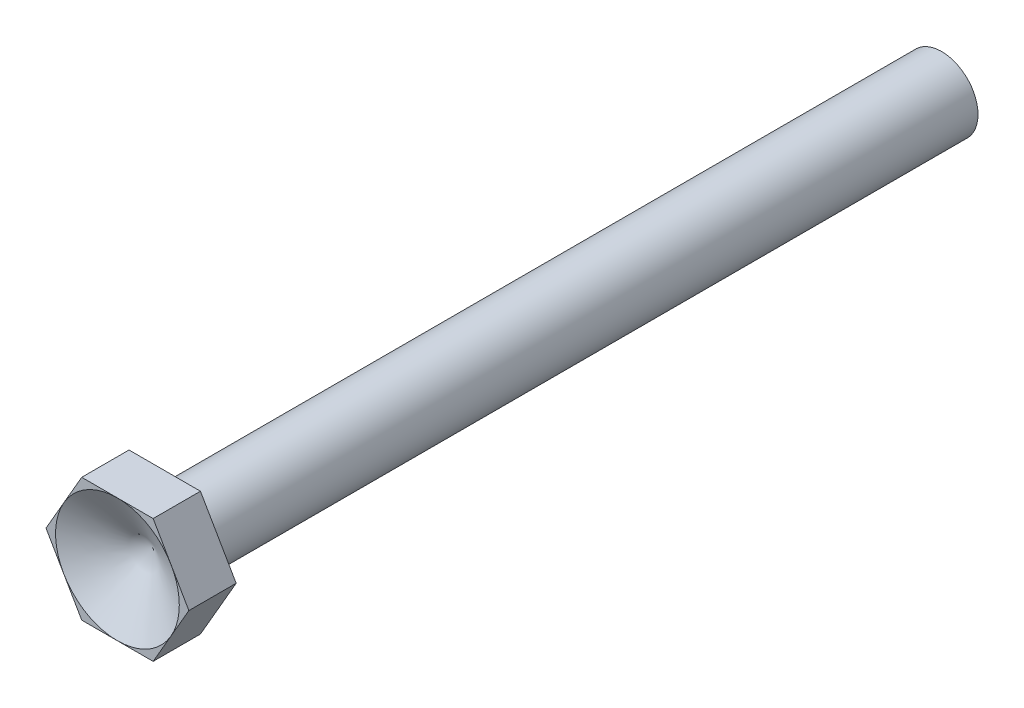
ISO-10303-21;
HEADER;
FILE_DESCRIPTION(('STEP AP214'),'2;1');
FILE_NAME('part.step','',(''),(''),'','','');
FILE_SCHEMA(('AUTOMOTIVE_DESIGN { 1 0 10303 214 1 1 1 1 }'));
ENDSEC;
DATA;
#1=APPLICATION_CONTEXT('core data for automotive mechanical design processes');
#2=APPLICATION_PROTOCOL_DEFINITION('international standard','automotive_design',2000,#1);
#3=PRODUCT_CONTEXT('',#1,'mechanical');
#4=PRODUCT('Part','Part','',(#3));
#5=PRODUCT_RELATED_PRODUCT_CATEGORY('part','',(#4));
#6=PRODUCT_DEFINITION_FORMATION('','',#4);
#7=PRODUCT_DEFINITION_CONTEXT('part definition',#1,'design');
#8=PRODUCT_DEFINITION('design','',#6,#7);
#9=PRODUCT_DEFINITION_SHAPE('','',#8);
#10=(LENGTH_UNIT() NAMED_UNIT(*) SI_UNIT(.MILLI.,.METRE.));
#11=(NAMED_UNIT(*) PLANE_ANGLE_UNIT() SI_UNIT($,.RADIAN.));
#12=(NAMED_UNIT(*) SI_UNIT($,.STERADIAN.) SOLID_ANGLE_UNIT());
#13=UNCERTAINTY_MEASURE_WITH_UNIT(LENGTH_MEASURE(1.E-05),#10,'distance_accuracy_value','');
#14=(GEOMETRIC_REPRESENTATION_CONTEXT(3) GLOBAL_UNCERTAINTY_ASSIGNED_CONTEXT((#13)) GLOBAL_UNIT_ASSIGNED_CONTEXT((#10,
#11,#12)) REPRESENTATION_CONTEXT('',''));
#15=CARTESIAN_POINT('',(0.,0.,0.));
#16=DIRECTION('',(0.,0.,1.));
#17=DIRECTION('',(1.,0.,0.));
#18=AXIS2_PLACEMENT_3D('',#15,#16,#17);
#19=CARTESIAN_POINT('',(0.,0.,116.5));
#20=DIRECTION('',(0.,0.,1.));
#21=DIRECTION('',(1.,0.,0.));
#22=AXIS2_PLACEMENT_3D('',#19,#20,#21);
#23=PLANE('',#22);
#24=CARTESIAN_POINT('',(0.,0.,116.5));
#25=DIRECTION('',(0.,0.,1.));
#26=DIRECTION('',(1.,0.,0.));
#27=AXIS2_PLACEMENT_3D('',#24,#25,#26);
#28=CIRCLE('',#27,17.);
#29=CARTESIAN_POINT('',(14.7224318643355,8.5,116.5));
#30=VERTEX_POINT('',#29);
#31=CARTESIAN_POINT('',(0.,17.,116.5));
#32=VERTEX_POINT('',#31);
#33=EDGE_CURVE('E173',#30,#32,#28,.T.);
#34=ORIENTED_EDGE('',*,*,#33,.F.);
#35=DIRECTION('',(-0.5,0.866025403784439,0.));
#36=VECTOR('',#35,1.);
#37=CARTESIAN_POINT('',(19.6299091524473,0.,116.5));
#38=LINE('',#37,#36);
#39=CARTESIAN_POINT('',(9.81495457622365,17.,116.5));
#40=VERTEX_POINT('',#39);
#41=EDGE_CURVE('E230',#30,#40,#38,.T.);
#42=ORIENTED_EDGE('',*,*,#41,.T.);
#43=DIRECTION('',(-1.,0.,0.));
#44=VECTOR('',#43,1.);
#45=CARTESIAN_POINT('',(9.81495457622365,17.,116.5));
#46=LINE('',#45,#44);
#47=EDGE_CURVE('E139',#40,#32,#46,.T.);
#48=ORIENTED_EDGE('',*,*,#47,.T.);
#49=EDGE_LOOP('',(#34,#42,#48));
#50=FACE_BOUND('',#49,.T.);
#51=ADVANCED_FACE('F51',(#50),#23,.T.);
#52=CARTESIAN_POINT('',(0.,0.,116.5));
#53=DIRECTION('',(0.,0.,1.));
#54=DIRECTION('',(1.,0.,0.));
#55=AXIS2_PLACEMENT_3D('',#52,#53,#54);
#56=CIRCLE('',#55,17.);
#57=CARTESIAN_POINT('',(-14.7224318643355,8.5,116.5));
#58=VERTEX_POINT('',#57);
#59=EDGE_CURVE('E11',#32,#58,#56,.T.);
#60=ORIENTED_EDGE('',*,*,#59,.F.);
#61=CARTESIAN_POINT('',(-9.81495457622364,17.,116.5));
#62=VERTEX_POINT('',#61);
#63=EDGE_CURVE('E238',#32,#62,#46,.T.);
#64=ORIENTED_EDGE('',*,*,#63,.T.);
#65=DIRECTION('',(-0.5,-0.866025403784439,0.));
#66=VECTOR('',#65,1.);
#67=CARTESIAN_POINT('',(-9.81495457622364,17.,116.5));
#68=LINE('',#67,#66);
#69=EDGE_CURVE('E138',#62,#58,#68,.T.);
#70=ORIENTED_EDGE('',*,*,#69,.T.);
#71=EDGE_LOOP('',(#60,#64,#70));
#72=FACE_BOUND('',#71,.T.);
#73=ADVANCED_FACE('F248',(#72),#23,.T.);
#74=CARTESIAN_POINT('',(-14.7224318643355,-8.5,116.5));
#75=VERTEX_POINT('',#74);
#76=EDGE_CURVE('E61',#58,#75,#56,.T.);
#77=ORIENTED_EDGE('',*,*,#76,.F.);
#78=CARTESIAN_POINT('',(-19.6299091524473,0.,116.5));
#79=VERTEX_POINT('',#78);
#80=EDGE_CURVE('E126',#58,#79,#68,.T.);
#81=ORIENTED_EDGE('',*,*,#80,.T.);
#82=DIRECTION('',(0.5,-0.866025403784439,0.));
#83=VECTOR('',#82,1.);
#84=CARTESIAN_POINT('',(-19.6299091524473,0.,116.5));
#85=LINE('',#84,#83);
#86=EDGE_CURVE('E131',#79,#75,#85,.T.);
#87=ORIENTED_EDGE('',*,*,#86,.T.);
#88=EDGE_LOOP('',(#77,#81,#87));
#89=FACE_BOUND('',#88,.T.);
#90=ADVANCED_FACE('F128',(#89),#23,.T.);
#91=CARTESIAN_POINT('',(0.,-17.,116.5));
#92=VERTEX_POINT('',#91);
#93=EDGE_CURVE('E213',#75,#92,#56,.T.);
#94=ORIENTED_EDGE('',*,*,#93,.F.);
#95=CARTESIAN_POINT('',(-9.81495457622364,-17.,116.5));
#96=VERTEX_POINT('',#95);
#97=EDGE_CURVE('E156',#75,#96,#85,.T.);
#98=ORIENTED_EDGE('',*,*,#97,.T.);
#99=DIRECTION('',(1.,0.,0.));
#100=VECTOR('',#99,1.);
#101=CARTESIAN_POINT('',(-9.81495457622364,-17.,116.5));
#102=LINE('',#101,#100);
#103=EDGE_CURVE('E161',#96,#92,#102,.T.);
#104=ORIENTED_EDGE('',*,*,#103,.T.);
#105=EDGE_LOOP('',(#94,#98,#104));
#106=FACE_BOUND('',#105,.T.);
#107=ADVANCED_FACE('F220',(#106),#23,.T.);
#108=CARTESIAN_POINT('',(14.7224318643355,-8.5,116.5));
#109=VERTEX_POINT('',#108);
#110=EDGE_CURVE('E68',#92,#109,#56,.T.);
#111=ORIENTED_EDGE('',*,*,#110,.F.);
#112=CARTESIAN_POINT('',(9.81495457622364,-17.,116.5));
#113=VERTEX_POINT('',#112);
#114=EDGE_CURVE('E76',#92,#113,#102,.T.);
#115=ORIENTED_EDGE('',*,*,#114,.T.);
#116=DIRECTION('',(0.5,0.866025403784438,0.));
#117=VECTOR('',#116,1.);
#118=CARTESIAN_POINT('',(9.81495457622364,-17.,116.5));
#119=LINE('',#118,#117);
#120=EDGE_CURVE('E226',#113,#109,#119,.T.);
#121=ORIENTED_EDGE('',*,*,#120,.T.);
#122=EDGE_LOOP('',(#111,#115,#121));
#123=FACE_BOUND('',#122,.T.);
#124=ADVANCED_FACE('F279',(#123),#23,.T.);
#125=CARTESIAN_POINT('',(0.,0.,110.));
#126=DIRECTION('',(0.,0.,-1.));
#127=DIRECTION('',(-1.,0.,0.));
#128=AXIS2_PLACEMENT_3D('',#125,#126,#127);
#129=CYLINDRICAL_SURFACE('',#128,10.);
#130=CARTESIAN_POINT('',(0.,0.,-110.));
#131=DIRECTION('',(0.,0.,1.));
#132=DIRECTION('',(1.,0.,0.));
#133=AXIS2_PLACEMENT_3D('',#130,#131,#132);
#134=CIRCLE('',#133,10.);
#135=CARTESIAN_POINT('',(10.,0.,-110.));
#136=VERTEX_POINT('',#135);
#137=EDGE_CURVE('E200',#136,#136,#134,.T.);
#138=ORIENTED_EDGE('',*,*,#137,.T.);
#139=EDGE_LOOP('',(#138));
#140=FACE_BOUND('',#139,.T.);
#141=CARTESIAN_POINT('',(0.,0.,103.5));
#142=DIRECTION('',(0.,0.,1.));
#143=DIRECTION('',(1.,0.,0.));
#144=AXIS2_PLACEMENT_3D('',#141,#142,#143);
#145=CIRCLE('',#144,10.);
#146=CARTESIAN_POINT('',(10.,0.,103.5));
#147=VERTEX_POINT('',#146);
#148=EDGE_CURVE('E203',#147,#147,#145,.T.);
#149=ORIENTED_EDGE('',*,*,#148,.F.);
#150=EDGE_LOOP('',(#149));
#151=FACE_BOUND('',#150,.T.);
#152=ADVANCED_FACE('F53',(#140,#151),#129,.T.);
#153=CARTESIAN_POINT('',(0.,0.,-110.));
#154=DIRECTION('',(0.,0.,1.));
#155=DIRECTION('',(1.,0.,0.));
#156=AXIS2_PLACEMENT_3D('',#153,#154,#155);
#157=PLANE('',#156);
#158=ORIENTED_EDGE('',*,*,#137,.F.);
#159=EDGE_LOOP('',(#158));
#160=FACE_BOUND('',#159,.T.);
#161=ADVANCED_FACE('F290',(#160),#157,.F.);
#162=CARTESIAN_POINT('',(9.81495457622364,-17.,116.5));
#163=DIRECTION('',(-0.866025403784438,0.5,0.));
#164=DIRECTION('',(-0.5,-0.866025403784439,0.));
#165=AXIS2_PLACEMENT_3D('',#162,#163,#164);
#166=PLANE('',#165);
#167=DIRECTION('',(0.5,0.866025403784438,0.));
#168=VECTOR('',#167,1.);
#169=CARTESIAN_POINT('',(9.81495457622364,-17.,103.5));
#170=LINE('',#169,#168);
#171=CARTESIAN_POINT('',(9.81495457622364,-17.,103.5));
#172=VERTEX_POINT('',#171);
#173=CARTESIAN_POINT('',(19.6299091524473,0.,103.5));
#174=VERTEX_POINT('',#173);
#175=EDGE_CURVE('E168',#172,#174,#170,.T.);
#176=ORIENTED_EDGE('',*,*,#175,.T.);
#177=DIRECTION('',(0.,0.,-1.));
#178=VECTOR('',#177,1.);
#179=CARTESIAN_POINT('',(19.6299091524473,0.,116.5));
#180=LINE('',#179,#178);
#181=CARTESIAN_POINT('',(19.6299091524473,0.,116.5));
#182=VERTEX_POINT('',#181);
#183=EDGE_CURVE('E196',#182,#174,#180,.T.);
#184=ORIENTED_EDGE('',*,*,#183,.F.);
#185=EDGE_CURVE('E112',#109,#182,#119,.T.);
#186=ORIENTED_EDGE('',*,*,#185,.F.);
#187=ORIENTED_EDGE('',*,*,#120,.F.);
#188=DIRECTION('',(0.,0.,-1.));
#189=VECTOR('',#188,1.);
#190=CARTESIAN_POINT('',(9.81495457622364,-17.,116.5));
#191=LINE('',#190,#189);
#192=EDGE_CURVE('E167',#113,#172,#191,.T.);
#193=ORIENTED_EDGE('',*,*,#192,.T.);
#194=EDGE_LOOP('',(#176,#184,#186,#187,#193));
#195=FACE_BOUND('',#194,.T.);
#196=ADVANCED_FACE('F227',(#195),#166,.F.);
#197=CARTESIAN_POINT('',(19.6299091524473,0.,116.5));
#198=DIRECTION('',(-0.866025403784439,-0.5,0.));
#199=DIRECTION('',(0.5,-0.866025403784439,0.));
#200=AXIS2_PLACEMENT_3D('',#197,#198,#199);
#201=PLANE('',#200);
#202=DIRECTION('',(-0.5,0.866025403784439,0.));
#203=VECTOR('',#202,1.);
#204=CARTESIAN_POINT('',(19.6299091524473,0.,103.5));
#205=LINE('',#204,#203);
#206=CARTESIAN_POINT('',(9.81495457622365,17.,103.5));
#207=VERTEX_POINT('',#206);
#208=EDGE_CURVE('E172',#174,#207,#205,.T.);
#209=ORIENTED_EDGE('',*,*,#208,.T.);
#210=DIRECTION('',(0.,0.,-1.));
#211=VECTOR('',#210,1.);
#212=CARTESIAN_POINT('',(9.81495457622365,17.,116.5));
#213=LINE('',#212,#211);
#214=EDGE_CURVE('E192',#40,#207,#213,.T.);
#215=ORIENTED_EDGE('',*,*,#214,.F.);
#216=ORIENTED_EDGE('',*,*,#41,.F.);
#217=EDGE_CURVE('E234',#182,#30,#38,.T.);
#218=ORIENTED_EDGE('',*,*,#217,.F.);
#219=ORIENTED_EDGE('',*,*,#183,.T.);
#220=EDGE_LOOP('',(#209,#215,#216,#218,#219));
#221=FACE_BOUND('',#220,.T.);
#222=ADVANCED_FACE('F256',(#221),#201,.F.);
#223=CARTESIAN_POINT('',(9.81495457622365,17.,116.5));
#224=DIRECTION('',(0.,-1.,0.));
#225=DIRECTION('',(1.,0.,0.));
#226=AXIS2_PLACEMENT_3D('',#223,#224,#225);
#227=PLANE('',#226);
#228=DIRECTION('',(-1.,0.,0.));
#229=VECTOR('',#228,1.);
#230=CARTESIAN_POINT('',(9.81495457622365,17.,103.5));
#231=LINE('',#230,#229);
#232=CARTESIAN_POINT('',(-9.81495457622364,17.,103.5));
#233=VERTEX_POINT('',#232);
#234=EDGE_CURVE('E176',#207,#233,#231,.T.);
#235=ORIENTED_EDGE('',*,*,#234,.T.);
#236=DIRECTION('',(0.,0.,-1.));
#237=VECTOR('',#236,1.);
#238=CARTESIAN_POINT('',(-9.81495457622364,17.,116.5));
#239=LINE('',#238,#237);
#240=EDGE_CURVE('E150',#62,#233,#239,.T.);
#241=ORIENTED_EDGE('',*,*,#240,.F.);
#242=ORIENTED_EDGE('',*,*,#63,.F.);
#243=ORIENTED_EDGE('',*,*,#47,.F.);
#244=ORIENTED_EDGE('',*,*,#214,.T.);
#245=EDGE_LOOP('',(#235,#241,#242,#243,#244));
#246=FACE_BOUND('',#245,.T.);
#247=ADVANCED_FACE('F250',(#246),#227,.F.);
#248=CARTESIAN_POINT('',(-9.81495457622364,17.,116.5));
#249=DIRECTION('',(0.866025403784439,-0.5,0.));
#250=DIRECTION('',(0.5,0.866025403784439,0.));
#251=AXIS2_PLACEMENT_3D('',#248,#249,#250);
#252=PLANE('',#251);
#253=DIRECTION('',(-0.5,-0.866025403784439,0.));
#254=VECTOR('',#253,1.);
#255=CARTESIAN_POINT('',(-9.81495457622364,17.,103.5));
#256=LINE('',#255,#254);
#257=CARTESIAN_POINT('',(-19.6299091524473,0.,103.5));
#258=VERTEX_POINT('',#257);
#259=EDGE_CURVE('E146',#233,#258,#256,.T.);
#260=ORIENTED_EDGE('',*,*,#259,.T.);
#261=DIRECTION('',(0.,0.,-1.));
#262=VECTOR('',#261,1.);
#263=CARTESIAN_POINT('',(-19.6299091524473,0.,116.5));
#264=LINE('',#263,#262);
#265=EDGE_CURVE('E142',#79,#258,#264,.T.);
#266=ORIENTED_EDGE('',*,*,#265,.F.);
#267=ORIENTED_EDGE('',*,*,#80,.F.);
#268=ORIENTED_EDGE('',*,*,#69,.F.);
#269=ORIENTED_EDGE('',*,*,#240,.T.);
#270=EDGE_LOOP('',(#260,#266,#267,#268,#269));
#271=FACE_BOUND('',#270,.T.);
#272=ADVANCED_FACE('F143',(#271),#252,.F.);
#273=CARTESIAN_POINT('',(-19.6299091524473,0.,116.5));
#274=DIRECTION('',(0.866025403784439,0.5,0.));
#275=DIRECTION('',(-0.5,0.866025403784439,0.));
#276=AXIS2_PLACEMENT_3D('',#273,#274,#275);
#277=PLANE('',#276);
#278=DIRECTION('',(0.5,-0.866025403784439,0.));
#279=VECTOR('',#278,1.);
#280=CARTESIAN_POINT('',(-19.6299091524473,0.,103.5));
#281=LINE('',#280,#279);
#282=CARTESIAN_POINT('',(-9.81495457622364,-17.,103.5));
#283=VERTEX_POINT('',#282);
#284=EDGE_CURVE('E181',#258,#283,#281,.T.);
#285=ORIENTED_EDGE('',*,*,#284,.T.);
#286=DIRECTION('',(0.,0.,-1.));
#287=VECTOR('',#286,1.);
#288=CARTESIAN_POINT('',(-9.81495457622364,-17.,116.5));
#289=LINE('',#288,#287);
#290=EDGE_CURVE('E151',#96,#283,#289,.T.);
#291=ORIENTED_EDGE('',*,*,#290,.F.);
#292=ORIENTED_EDGE('',*,*,#97,.F.);
#293=ORIENTED_EDGE('',*,*,#86,.F.);
#294=ORIENTED_EDGE('',*,*,#265,.T.);
#295=EDGE_LOOP('',(#285,#291,#292,#293,#294));
#296=FACE_BOUND('',#295,.T.);
#297=ADVANCED_FACE('F154',(#296),#277,.F.);
#298=CARTESIAN_POINT('',(-9.81495457622364,-17.,116.5));
#299=DIRECTION('',(0.,1.,0.));
#300=DIRECTION('',(-1.,0.,0.));
#301=AXIS2_PLACEMENT_3D('',#298,#299,#300);
#302=PLANE('',#301);
#303=DIRECTION('',(1.,0.,0.));
#304=VECTOR('',#303,1.);
#305=CARTESIAN_POINT('',(-9.81495457622364,-17.,103.5));
#306=LINE('',#305,#304);
#307=EDGE_CURVE('E104',#283,#172,#306,.T.);
#308=ORIENTED_EDGE('',*,*,#307,.T.);
#309=ORIENTED_EDGE('',*,*,#192,.F.);
#310=ORIENTED_EDGE('',*,*,#114,.F.);
#311=ORIENTED_EDGE('',*,*,#103,.F.);
#312=ORIENTED_EDGE('',*,*,#290,.T.);
#313=EDGE_LOOP('',(#308,#309,#310,#311,#312));
#314=FACE_BOUND('',#313,.T.);
#315=ADVANCED_FACE('F222',(#314),#302,.F.);
#316=EDGE_CURVE('E55',#109,#30,#56,.T.);
#317=ORIENTED_EDGE('',*,*,#316,.F.);
#318=ORIENTED_EDGE('',*,*,#185,.T.);
#319=ORIENTED_EDGE('',*,*,#217,.T.);
#320=EDGE_LOOP('',(#317,#318,#319));
#321=FACE_BOUND('',#320,.T.);
#322=ADVANCED_FACE('F259',(#321),#23,.T.);
#323=CARTESIAN_POINT('',(0.,0.,103.5));
#324=DIRECTION('',(0.,0.,1.));
#325=DIRECTION('',(1.,0.,0.));
#326=AXIS2_PLACEMENT_3D('',#323,#324,#325);
#327=PLANE('',#326);
#328=ORIENTED_EDGE('',*,*,#148,.T.);
#329=EDGE_LOOP('',(#328));
#330=FACE_BOUND('',#329,.T.);
#331=ORIENTED_EDGE('',*,*,#175,.F.);
#332=ORIENTED_EDGE('',*,*,#307,.F.);
#333=ORIENTED_EDGE('',*,*,#284,.F.);
#334=ORIENTED_EDGE('',*,*,#259,.F.);
#335=ORIENTED_EDGE('',*,*,#234,.F.);
#336=ORIENTED_EDGE('',*,*,#208,.F.);
#337=EDGE_LOOP('',(#331,#332,#333,#334,#335,#336));
#338=FACE_BOUND('',#337,.T.);
#339=ADVANCED_FACE('F254',(#330,#338),#327,.F.);
#340=CARTESIAN_POINT('',(0.,0.,116.5));
#341=DIRECTION('',(0.,0.,1.));
#342=DIRECTION('',(1.,0.,0.));
#343=AXIS2_PLACEMENT_3D('',#340,#341,#342);
#344=CONICAL_SURFACE('',#343,17.,1.0471975511966);
#345=CARTESIAN_POINT('',(0.,0.,106.685045423776));
#346=VERTEX_POINT('',#345);
#347=VERTEX_LOOP('',#346);
#348=FACE_BOUND('',#347,.T.);
#349=ORIENTED_EDGE('',*,*,#33,.T.);
#350=ORIENTED_EDGE('',*,*,#59,.T.);
#351=ORIENTED_EDGE('',*,*,#76,.T.);
#352=ORIENTED_EDGE('',*,*,#93,.T.);
#353=ORIENTED_EDGE('',*,*,#110,.T.);
#354=ORIENTED_EDGE('',*,*,#316,.T.);
#355=EDGE_LOOP('',(#349,#350,#351,#352,#353,#354));
#356=FACE_BOUND('',#355,.T.);
#357=ADVANCED_FACE('F217',(#348,#356),#344,.F.);
#358=CLOSED_SHELL('',(#51,#73,#90,#107,#124,#152,#161,#196,#222,#247,#272,#297,#315,#322,#339,#357));
#359=MANIFOLD_SOLID_BREP('B2',#358);
#360=ADVANCED_BREP_SHAPE_REPRESENTATION('',(#18,#359),#14);
#361=SHAPE_DEFINITION_REPRESENTATION(#9,#360);
ENDSEC;
END-ISO-10303-21;
